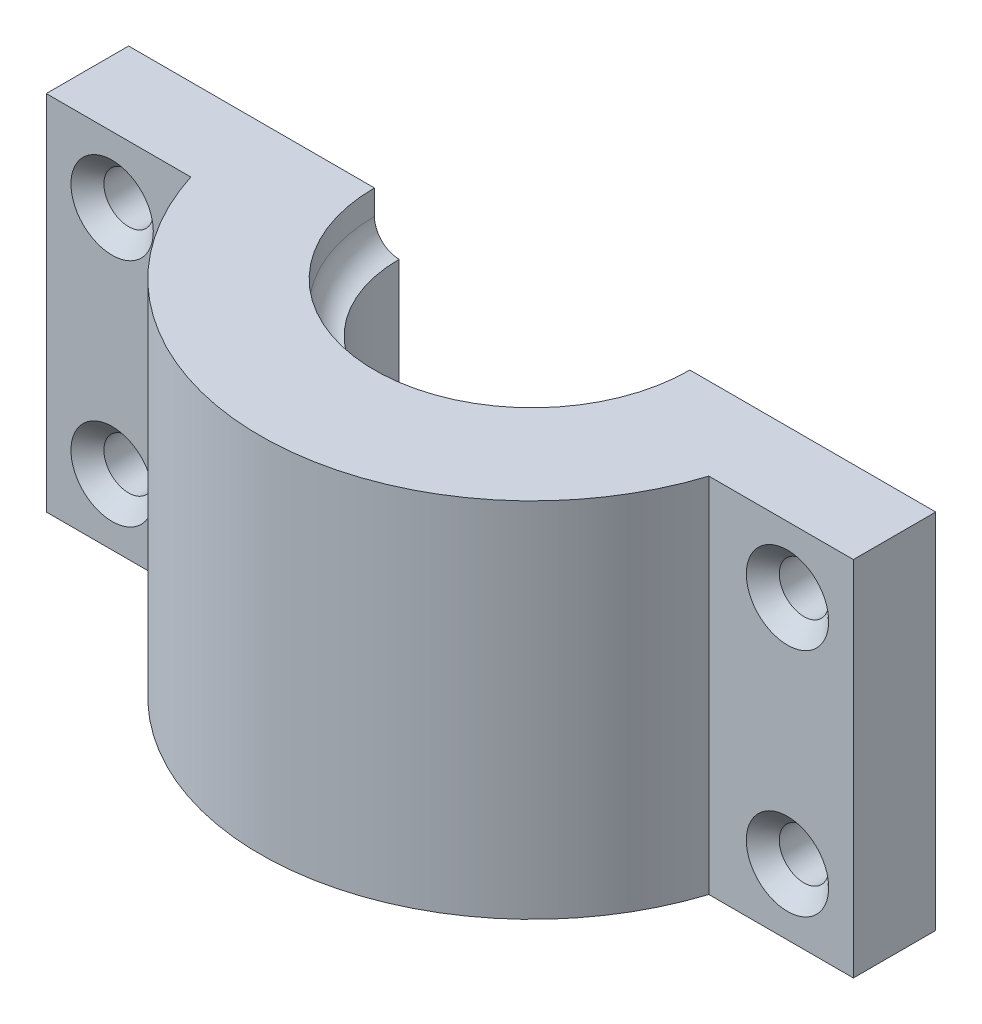
ISO-10303-21;
HEADER;
FILE_DESCRIPTION(('STEP AP214'),'2;1');
FILE_NAME('part.step','',(''),(''),'','','');
FILE_SCHEMA(('AUTOMOTIVE_DESIGN { 1 0 10303 214 1 1 1 1 }'));
ENDSEC;
DATA;
#1=APPLICATION_CONTEXT('core data for automotive mechanical design processes');
#2=APPLICATION_PROTOCOL_DEFINITION('international standard','automotive_design',2000,#1);
#3=PRODUCT_CONTEXT('',#1,'mechanical');
#4=PRODUCT('Part','Part','',(#3));
#5=PRODUCT_RELATED_PRODUCT_CATEGORY('part','',(#4));
#6=PRODUCT_DEFINITION_FORMATION('','',#4);
#7=PRODUCT_DEFINITION_CONTEXT('part definition',#1,'design');
#8=PRODUCT_DEFINITION('design','',#6,#7);
#9=PRODUCT_DEFINITION_SHAPE('','',#8);
#10=(LENGTH_UNIT() NAMED_UNIT(*) SI_UNIT(.MILLI.,.METRE.));
#11=(NAMED_UNIT(*) PLANE_ANGLE_UNIT() SI_UNIT($,.RADIAN.));
#12=(NAMED_UNIT(*) SI_UNIT($,.STERADIAN.) SOLID_ANGLE_UNIT());
#13=UNCERTAINTY_MEASURE_WITH_UNIT(LENGTH_MEASURE(1.E-05),#10,'distance_accuracy_value','');
#14=(GEOMETRIC_REPRESENTATION_CONTEXT(3) GLOBAL_UNCERTAINTY_ASSIGNED_CONTEXT((#13)) GLOBAL_UNIT_ASSIGNED_CONTEXT((#10,
#11,#12)) REPRESENTATION_CONTEXT('',''));
#15=CARTESIAN_POINT('',(0.,0.,0.));
#16=DIRECTION('',(0.,0.,1.));
#17=DIRECTION('',(1.,0.,0.));
#18=AXIS2_PLACEMENT_3D('',#15,#16,#17);
#19=CARTESIAN_POINT('',(0.,-22.,0.));
#20=DIRECTION('',(0.,1.,0.));
#21=DIRECTION('',(0.,0.,1.));
#22=AXIS2_PLACEMENT_3D('',#19,#20,#21);
#23=CYLINDRICAL_SURFACE('',#22,16.5);
#24=CARTESIAN_POINT('',(0.,0.,0.));
#25=DIRECTION('',(0.,1.,0.));
#26=DIRECTION('',(0.,0.,1.));
#27=AXIS2_PLACEMENT_3D('',#24,#25,#26);
#28=CIRCLE('',#27,16.5);
#29=CARTESIAN_POINT('',(-15.7241851935164,0.,5.));
#30=VERTEX_POINT('',#29);
#31=CARTESIAN_POINT('',(15.7241851935164,0.,5.));
#32=VERTEX_POINT('',#31);
#33=EDGE_CURVE('E194',#30,#32,#28,.T.);
#34=ORIENTED_EDGE('',*,*,#33,.F.);
#35=DIRECTION('',(0.,1.,0.));
#36=VECTOR('',#35,1.);
#37=CARTESIAN_POINT('',(-15.7241851935164,-22.,5.));
#38=LINE('',#37,#36);
#39=CARTESIAN_POINT('',(-15.7241851935164,-22.,5.));
#40=VERTEX_POINT('',#39);
#41=EDGE_CURVE('E218',#40,#30,#38,.T.);
#42=ORIENTED_EDGE('',*,*,#41,.F.);
#43=CARTESIAN_POINT('',(0.,-22.,0.));
#44=DIRECTION('',(0.,1.,0.));
#45=DIRECTION('',(0.,0.,1.));
#46=AXIS2_PLACEMENT_3D('',#43,#44,#45);
#47=CIRCLE('',#46,16.5);
#48=CARTESIAN_POINT('',(15.7241851935164,-22.,5.));
#49=VERTEX_POINT('',#48);
#50=EDGE_CURVE('E168',#40,#49,#47,.T.);
#51=ORIENTED_EDGE('',*,*,#50,.T.);
#52=DIRECTION('',(0.,1.,0.));
#53=VECTOR('',#52,1.);
#54=CARTESIAN_POINT('',(15.7241851935164,-22.,5.));
#55=LINE('',#54,#53);
#56=EDGE_CURVE('E193',#49,#32,#55,.T.);
#57=ORIENTED_EDGE('',*,*,#56,.T.);
#58=EDGE_LOOP('',(#34,#42,#51,#57));
#59=FACE_BOUND('',#58,.T.);
#60=ADVANCED_FACE('F47',(#59),#23,.T.);
#61=CARTESIAN_POINT('',(0.,-22.,5.));
#62=DIRECTION('',(0.,0.,1.));
#63=DIRECTION('',(1.,0.,0.));
#64=AXIS2_PLACEMENT_3D('',#61,#62,#63);
#65=PLANE('',#64);
#66=CARTESIAN_POINT('',(-20.5,-4.,5.));
#67=DIRECTION('',(0.,0.,1.));
#68=DIRECTION('',(1.,0.,0.));
#69=AXIS2_PLACEMENT_3D('',#66,#67,#68);
#70=CIRCLE('',#69,2.5);
#71=CARTESIAN_POINT('',(-18.,-4.,5.));
#72=VERTEX_POINT('',#71);
#73=EDGE_CURVE('E274',#72,#72,#70,.F.);
#74=ORIENTED_EDGE('',*,*,#73,.T.);
#75=EDGE_LOOP('',(#74));
#76=FACE_BOUND('',#75,.T.);
#77=CARTESIAN_POINT('',(-20.5,-18.,5.));
#78=DIRECTION('',(0.,0.,1.));
#79=DIRECTION('',(1.,0.,0.));
#80=AXIS2_PLACEMENT_3D('',#77,#78,#79);
#81=CIRCLE('',#80,2.50000000000002);
#82=CARTESIAN_POINT('',(-18.,-18.,5.));
#83=VERTEX_POINT('',#82);
#84=EDGE_CURVE('E270',#83,#83,#81,.F.);
#85=ORIENTED_EDGE('',*,*,#84,.T.);
#86=EDGE_LOOP('',(#85));
#87=FACE_BOUND('',#86,.T.);
#88=DIRECTION('',(1.,0.,0.));
#89=VECTOR('',#88,1.);
#90=CARTESIAN_POINT('',(0.,0.,5.));
#91=LINE('',#90,#89);
#92=CARTESIAN_POINT('',(-24.5,0.,5.));
#93=VERTEX_POINT('',#92);
#94=EDGE_CURVE('E173',#93,#30,#91,.T.);
#95=ORIENTED_EDGE('',*,*,#94,.F.);
#96=DIRECTION('',(0.,1.,0.));
#97=VECTOR('',#96,1.);
#98=CARTESIAN_POINT('',(-24.5,-22.,5.));
#99=LINE('',#98,#97);
#100=CARTESIAN_POINT('',(-24.5,-22.,5.));
#101=VERTEX_POINT('',#100);
#102=EDGE_CURVE('E222',#101,#93,#99,.T.);
#103=ORIENTED_EDGE('',*,*,#102,.F.);
#104=DIRECTION('',(1.,0.,0.));
#105=VECTOR('',#104,1.);
#106=CARTESIAN_POINT('',(0.,-22.,5.));
#107=LINE('',#106,#105);
#108=EDGE_CURVE('E189',#101,#40,#107,.T.);
#109=ORIENTED_EDGE('',*,*,#108,.T.);
#110=ORIENTED_EDGE('',*,*,#41,.T.);
#111=EDGE_LOOP('',(#95,#103,#109,#110));
#112=FACE_BOUND('',#111,.T.);
#113=ADVANCED_FACE('F326',(#76,#87,#112),#65,.T.);
#114=CARTESIAN_POINT('',(-24.5,-22.,0.));
#115=DIRECTION('',(-1.,0.,0.));
#116=DIRECTION('',(0.,0.,1.));
#117=AXIS2_PLACEMENT_3D('',#114,#115,#116);
#118=PLANE('',#117);
#119=DIRECTION('',(0.,0.,1.));
#120=VECTOR('',#119,1.);
#121=CARTESIAN_POINT('',(-24.5,0.,0.));
#122=LINE('',#121,#120);
#123=CARTESIAN_POINT('',(-24.5,0.,0.));
#124=VERTEX_POINT('',#123);
#125=EDGE_CURVE('E211',#124,#93,#122,.T.);
#126=ORIENTED_EDGE('',*,*,#125,.F.);
#127=DIRECTION('',(0.,1.,0.));
#128=VECTOR('',#127,1.);
#129=CARTESIAN_POINT('',(-24.5,-22.,0.));
#130=LINE('',#129,#128);
#131=CARTESIAN_POINT('',(-24.5,-22.,0.));
#132=VERTEX_POINT('',#131);
#133=EDGE_CURVE('E225',#132,#124,#130,.T.);
#134=ORIENTED_EDGE('',*,*,#133,.F.);
#135=DIRECTION('',(0.,0.,1.));
#136=VECTOR('',#135,1.);
#137=CARTESIAN_POINT('',(-24.5,-22.,0.));
#138=LINE('',#137,#136);
#139=EDGE_CURVE('E185',#132,#101,#138,.T.);
#140=ORIENTED_EDGE('',*,*,#139,.T.);
#141=ORIENTED_EDGE('',*,*,#102,.T.);
#142=EDGE_LOOP('',(#126,#134,#140,#141));
#143=FACE_BOUND('',#142,.T.);
#144=ADVANCED_FACE('F330',(#143),#118,.T.);
#145=CARTESIAN_POINT('',(0.,-22.,0.));
#146=DIRECTION('',(0.,0.,-1.));
#147=DIRECTION('',(-1.,0.,0.));
#148=AXIS2_PLACEMENT_3D('',#145,#146,#147);
#149=PLANE('',#148);
#150=DIRECTION('',(0.,1.,0.));
#151=VECTOR('',#150,1.);
#152=CARTESIAN_POINT('',(-9.575,1.86021184115159,0.));
#153=LINE('',#152,#151);
#154=CARTESIAN_POINT('',(-9.575,-1.5,0.));
#155=VERTEX_POINT('',#154);
#156=CARTESIAN_POINT('',(-9.575,0.,0.));
#157=VERTEX_POINT('',#156);
#158=EDGE_CURVE('E63',#155,#157,#153,.T.);
#159=ORIENTED_EDGE('',*,*,#158,.F.);
#160=CARTESIAN_POINT('',(-8.075,-1.5,0.));
#161=DIRECTION('',(0.,0.,-1.));
#162=DIRECTION('',(-1.,0.,0.));
#163=AXIS2_PLACEMENT_3D('',#160,#161,#162);
#164=CIRCLE('',#163,1.5);
#165=CARTESIAN_POINT('',(-8.075,-3.,0.));
#166=VERTEX_POINT('',#165);
#167=EDGE_CURVE('E134',#166,#155,#164,.T.);
#168=ORIENTED_EDGE('',*,*,#167,.F.);
#169=DIRECTION('',(0.,1.,0.));
#170=VECTOR('',#169,1.);
#171=CARTESIAN_POINT('',(-8.075,-22.,0.));
#172=LINE('',#171,#170);
#173=CARTESIAN_POINT('',(-8.075,-14.9999999999999,0.));
#174=VERTEX_POINT('',#173);
#175=EDGE_CURVE('E228',#174,#166,#172,.T.);
#176=ORIENTED_EDGE('',*,*,#175,.F.);
#177=DIRECTION('',(0.274721127897375,0.961523947640824,0.));
#178=VECTOR('',#177,1.);
#179=CARTESIAN_POINT('',(0.,13.2625000000004,0.));
#180=LINE('',#179,#178);
#181=CARTESIAN_POINT('',(-10.075,-22.,0.));
#182=VERTEX_POINT('',#181);
#183=EDGE_CURVE('E57',#174,#182,#180,.F.);
#184=ORIENTED_EDGE('',*,*,#183,.T.);
#185=DIRECTION('',(-1.,0.,0.));
#186=VECTOR('',#185,1.);
#187=CARTESIAN_POINT('',(0.,-22.,0.));
#188=LINE('',#187,#186);
#189=EDGE_CURVE('E182',#182,#132,#188,.T.);
#190=ORIENTED_EDGE('',*,*,#189,.T.);
#191=ORIENTED_EDGE('',*,*,#133,.T.);
#192=DIRECTION('',(-1.,0.,0.));
#193=VECTOR('',#192,1.);
#194=CARTESIAN_POINT('',(0.,0.,0.));
#195=LINE('',#194,#193);
#196=EDGE_CURVE('E153',#157,#124,#195,.T.);
#197=ORIENTED_EDGE('',*,*,#196,.F.);
#198=EDGE_LOOP('',(#159,#168,#176,#184,#190,#191,#197));
#199=FACE_BOUND('',#198,.T.);
#200=CARTESIAN_POINT('',(-20.5,-18.,0.));
#201=DIRECTION('',(0.,0.,-1.));
#202=DIRECTION('',(-1.,0.,0.));
#203=AXIS2_PLACEMENT_3D('',#200,#201,#202);
#204=CIRCLE('',#203,1.5);
#205=CARTESIAN_POINT('',(-22.,-18.,0.));
#206=VERTEX_POINT('',#205);
#207=EDGE_CURVE('E199',#206,#206,#204,.T.);
#208=ORIENTED_EDGE('',*,*,#207,.F.);
#209=EDGE_LOOP('',(#208));
#210=FACE_BOUND('',#209,.T.);
#211=CARTESIAN_POINT('',(-20.5,-4.,0.));
#212=DIRECTION('',(0.,0.,-1.));
#213=DIRECTION('',(-1.,0.,0.));
#214=AXIS2_PLACEMENT_3D('',#211,#212,#213);
#215=CIRCLE('',#214,1.5);
#216=CARTESIAN_POINT('',(-22.,-4.,0.));
#217=VERTEX_POINT('',#216);
#218=EDGE_CURVE('E167',#217,#217,#215,.T.);
#219=ORIENTED_EDGE('',*,*,#218,.F.);
#220=EDGE_LOOP('',(#219));
#221=FACE_BOUND('',#220,.T.);
#222=ADVANCED_FACE('F150',(#199,#210,#221),#149,.T.);
#223=CARTESIAN_POINT('',(0.,-22.,0.));
#224=DIRECTION('',(0.,1.,0.));
#225=DIRECTION('',(0.,0.,1.));
#226=AXIS2_PLACEMENT_3D('',#223,#224,#225);
#227=CYLINDRICAL_SURFACE('',#226,8.075);
#228=ORIENTED_EDGE('',*,*,#175,.T.);
#229=CARTESIAN_POINT('',(0.,-3.,0.));
#230=DIRECTION('',(0.,1.,0.));
#231=DIRECTION('',(-1.,0.,0.));
#232=AXIS2_PLACEMENT_3D('',#229,#230,#231);
#233=CIRCLE('',#232,8.075);
#234=CARTESIAN_POINT('',(8.075,-3.,0.));
#235=VERTEX_POINT('',#234);
#236=EDGE_CURVE('E139',#166,#235,#233,.T.);
#237=ORIENTED_EDGE('',*,*,#236,.T.);
#238=DIRECTION('',(0.,1.,0.));
#239=VECTOR('',#238,1.);
#240=CARTESIAN_POINT('',(8.075,-22.,0.));
#241=LINE('',#240,#239);
#242=CARTESIAN_POINT('',(8.075,-14.9999999999999,0.));
#243=VERTEX_POINT('',#242);
#244=EDGE_CURVE('E231',#243,#235,#241,.T.);
#245=ORIENTED_EDGE('',*,*,#244,.F.);
#246=CARTESIAN_POINT('',(0.,-14.9999999999999,0.));
#247=DIRECTION('',(0.,1.,0.));
#248=DIRECTION('',(0.,0.,1.));
#249=AXIS2_PLACEMENT_3D('',#246,#247,#248);
#250=CIRCLE('',#249,8.075);
#251=EDGE_CURVE('E71',#243,#174,#250,.F.);
#252=ORIENTED_EDGE('',*,*,#251,.T.);
#253=EDGE_LOOP('',(#228,#237,#245,#252));
#254=FACE_BOUND('',#253,.T.);
#255=ADVANCED_FACE('F304',(#254),#227,.F.);
#256=CARTESIAN_POINT('',(0.,-22.,0.));
#257=DIRECTION('',(0.,0.,1.));
#258=DIRECTION('',(1.,0.,0.));
#259=AXIS2_PLACEMENT_3D('',#256,#257,#258);
#260=PLANE('',#259);
#261=CARTESIAN_POINT('',(20.5,-4.,0.));
#262=DIRECTION('',(0.,0.,1.));
#263=DIRECTION('',(1.,0.,0.));
#264=AXIS2_PLACEMENT_3D('',#261,#262,#263);
#265=CIRCLE('',#264,1.5);
#266=CARTESIAN_POINT('',(22.,-4.,0.));
#267=VERTEX_POINT('',#266);
#268=EDGE_CURVE('E160',#267,#267,#265,.T.);
#269=ORIENTED_EDGE('',*,*,#268,.T.);
#270=EDGE_LOOP('',(#269));
#271=FACE_BOUND('',#270,.T.);
#272=CARTESIAN_POINT('',(20.5,-18.,0.));
#273=DIRECTION('',(0.,0.,1.));
#274=DIRECTION('',(1.,0.,0.));
#275=AXIS2_PLACEMENT_3D('',#272,#273,#274);
#276=CIRCLE('',#275,1.5);
#277=CARTESIAN_POINT('',(22.,-18.,0.));
#278=VERTEX_POINT('',#277);
#279=EDGE_CURVE('E155',#278,#278,#276,.T.);
#280=ORIENTED_EDGE('',*,*,#279,.T.);
#281=EDGE_LOOP('',(#280));
#282=FACE_BOUND('',#281,.T.);
#283=CARTESIAN_POINT('',(8.075,-1.5,0.));
#284=DIRECTION('',(0.,0.,1.));
#285=DIRECTION('',(1.,0.,0.));
#286=AXIS2_PLACEMENT_3D('',#283,#284,#285);
#287=CIRCLE('',#286,1.5);
#288=CARTESIAN_POINT('',(9.575,-1.5,0.));
#289=VERTEX_POINT('',#288);
#290=EDGE_CURVE('E147',#235,#289,#287,.T.);
#291=ORIENTED_EDGE('',*,*,#290,.T.);
#292=DIRECTION('',(0.,1.,0.));
#293=VECTOR('',#292,1.);
#294=CARTESIAN_POINT('',(9.575,1.86021184115158,0.));
#295=LINE('',#294,#293);
#296=CARTESIAN_POINT('',(9.575,0.,0.));
#297=VERTEX_POINT('',#296);
#298=EDGE_CURVE('E142',#289,#297,#295,.T.);
#299=ORIENTED_EDGE('',*,*,#298,.T.);
#300=DIRECTION('',(1.,0.,0.));
#301=VECTOR('',#300,1.);
#302=CARTESIAN_POINT('',(0.,0.,0.));
#303=LINE('',#302,#301);
#304=CARTESIAN_POINT('',(24.5,0.,0.));
#305=VERTEX_POINT('',#304);
#306=EDGE_CURVE('E206',#297,#305,#303,.T.);
#307=ORIENTED_EDGE('',*,*,#306,.T.);
#308=DIRECTION('',(0.,1.,0.));
#309=VECTOR('',#308,1.);
#310=CARTESIAN_POINT('',(24.5,-22.,0.));
#311=LINE('',#310,#309);
#312=CARTESIAN_POINT('',(24.5,-22.,0.));
#313=VERTEX_POINT('',#312);
#314=EDGE_CURVE('E235',#313,#305,#311,.T.);
#315=ORIENTED_EDGE('',*,*,#314,.F.);
#316=DIRECTION('',(1.,0.,0.));
#317=VECTOR('',#316,1.);
#318=CARTESIAN_POINT('',(0.,-22.,0.));
#319=LINE('',#318,#317);
#320=CARTESIAN_POINT('',(10.075,-22.,0.));
#321=VERTEX_POINT('',#320);
#322=EDGE_CURVE('E179',#321,#313,#319,.T.);
#323=ORIENTED_EDGE('',*,*,#322,.F.);
#324=DIRECTION('',(-0.274721127897375,0.961523947640824,0.));
#325=VECTOR('',#324,1.);
#326=CARTESIAN_POINT('',(0.,13.2625000000004,0.));
#327=LINE('',#326,#325);
#328=EDGE_CURVE('E286',#321,#243,#327,.T.);
#329=ORIENTED_EDGE('',*,*,#328,.T.);
#330=ORIENTED_EDGE('',*,*,#244,.T.);
#331=EDGE_LOOP('',(#291,#299,#307,#315,#323,#329,#330));
#332=FACE_BOUND('',#331,.T.);
#333=ADVANCED_FACE('F302',(#271,#282,#332),#260,.F.);
#334=CARTESIAN_POINT('',(24.5,-22.,0.));
#335=DIRECTION('',(-1.,0.,0.));
#336=DIRECTION('',(0.,0.,1.));
#337=AXIS2_PLACEMENT_3D('',#334,#335,#336);
#338=PLANE('',#337);
#339=DIRECTION('',(0.,0.,1.));
#340=VECTOR('',#339,1.);
#341=CARTESIAN_POINT('',(24.5,0.,0.));
#342=LINE('',#341,#340);
#343=CARTESIAN_POINT('',(24.5,0.,5.));
#344=VERTEX_POINT('',#343);
#345=EDGE_CURVE('E203',#305,#344,#342,.T.);
#346=ORIENTED_EDGE('',*,*,#345,.T.);
#347=DIRECTION('',(0.,1.,0.));
#348=VECTOR('',#347,1.);
#349=CARTESIAN_POINT('',(24.5,-22.,5.));
#350=LINE('',#349,#348);
#351=CARTESIAN_POINT('',(24.5,-22.,5.));
#352=VERTEX_POINT('',#351);
#353=EDGE_CURVE('E239',#352,#344,#350,.T.);
#354=ORIENTED_EDGE('',*,*,#353,.F.);
#355=DIRECTION('',(0.,0.,1.));
#356=VECTOR('',#355,1.);
#357=CARTESIAN_POINT('',(24.5,-22.,0.));
#358=LINE('',#357,#356);
#359=EDGE_CURVE('E176',#313,#352,#358,.T.);
#360=ORIENTED_EDGE('',*,*,#359,.F.);
#361=ORIENTED_EDGE('',*,*,#314,.T.);
#362=EDGE_LOOP('',(#346,#354,#360,#361));
#363=FACE_BOUND('',#362,.T.);
#364=ADVANCED_FACE('F316',(#363),#338,.F.);
#365=CARTESIAN_POINT('',(0.,-22.,5.));
#366=DIRECTION('',(0.,0.,-1.));
#367=DIRECTION('',(-1.,0.,0.));
#368=AXIS2_PLACEMENT_3D('',#365,#366,#367);
#369=PLANE('',#368);
#370=CARTESIAN_POINT('',(20.5,-4.,5.));
#371=DIRECTION('',(0.,0.,-1.));
#372=DIRECTION('',(-1.,0.,0.));
#373=AXIS2_PLACEMENT_3D('',#370,#371,#372);
#374=CIRCLE('',#373,2.5);
#375=CARTESIAN_POINT('',(18.,-4.,5.));
#376=VERTEX_POINT('',#375);
#377=EDGE_CURVE('E258',#376,#376,#374,.T.);
#378=ORIENTED_EDGE('',*,*,#377,.T.);
#379=EDGE_LOOP('',(#378));
#380=FACE_BOUND('',#379,.T.);
#381=CARTESIAN_POINT('',(20.5,-18.,5.));
#382=DIRECTION('',(0.,0.,-1.));
#383=DIRECTION('',(-1.,0.,0.));
#384=AXIS2_PLACEMENT_3D('',#381,#382,#383);
#385=CIRCLE('',#384,2.50000000000002);
#386=CARTESIAN_POINT('',(18.,-18.,5.));
#387=VERTEX_POINT('',#386);
#388=EDGE_CURVE('E254',#387,#387,#385,.T.);
#389=ORIENTED_EDGE('',*,*,#388,.T.);
#390=EDGE_LOOP('',(#389));
#391=FACE_BOUND('',#390,.T.);
#392=DIRECTION('',(-1.,0.,0.));
#393=VECTOR('',#392,1.);
#394=CARTESIAN_POINT('',(0.,0.,5.));
#395=LINE('',#394,#393);
#396=EDGE_CURVE('E198',#344,#32,#395,.T.);
#397=ORIENTED_EDGE('',*,*,#396,.T.);
#398=ORIENTED_EDGE('',*,*,#56,.F.);
#399=DIRECTION('',(-1.,0.,0.));
#400=VECTOR('',#399,1.);
#401=CARTESIAN_POINT('',(0.,-22.,5.));
#402=LINE('',#401,#400);
#403=EDGE_CURVE('E172',#352,#49,#402,.T.);
#404=ORIENTED_EDGE('',*,*,#403,.F.);
#405=ORIENTED_EDGE('',*,*,#353,.T.);
#406=EDGE_LOOP('',(#397,#398,#404,#405));
#407=FACE_BOUND('',#406,.T.);
#408=ADVANCED_FACE('F320',(#380,#391,#407),#369,.F.);
#409=CARTESIAN_POINT('',(0.,-22.,0.));
#410=DIRECTION('',(0.,1.,0.));
#411=DIRECTION('',(0.,0.,1.));
#412=AXIS2_PLACEMENT_3D('',#409,#410,#411);
#413=PLANE('',#412);
#414=ORIENTED_EDGE('',*,*,#189,.F.);
#415=CARTESIAN_POINT('',(0.,-22.,0.));
#416=DIRECTION('',(0.,1.,0.));
#417=DIRECTION('',(0.,0.,1.));
#418=AXIS2_PLACEMENT_3D('',#415,#416,#417);
#419=CIRCLE('',#418,10.075);
#420=EDGE_CURVE('E282',#182,#321,#419,.T.);
#421=ORIENTED_EDGE('',*,*,#420,.T.);
#422=ORIENTED_EDGE('',*,*,#322,.T.);
#423=ORIENTED_EDGE('',*,*,#359,.T.);
#424=ORIENTED_EDGE('',*,*,#403,.T.);
#425=ORIENTED_EDGE('',*,*,#50,.F.);
#426=ORIENTED_EDGE('',*,*,#108,.F.);
#427=ORIENTED_EDGE('',*,*,#139,.F.);
#428=EDGE_LOOP('',(#414,#421,#422,#423,#424,#425,#426,#427));
#429=FACE_BOUND('',#428,.T.);
#430=ADVANCED_FACE('F298',(#429),#413,.F.);
#431=CARTESIAN_POINT('',(0.,0.,0.));
#432=DIRECTION('',(0.,1.,0.));
#433=DIRECTION('',(0.,0.,1.));
#434=AXIS2_PLACEMENT_3D('',#431,#432,#433);
#435=PLANE('',#434);
#436=CARTESIAN_POINT('',(0.,0.,0.));
#437=DIRECTION('',(0.,1.,0.));
#438=DIRECTION('',(0.,0.,1.));
#439=AXIS2_PLACEMENT_3D('',#436,#437,#438);
#440=CIRCLE('',#439,9.575);
#441=EDGE_CURVE('E11',#157,#297,#440,.T.);
#442=ORIENTED_EDGE('',*,*,#441,.F.);
#443=ORIENTED_EDGE('',*,*,#196,.T.);
#444=ORIENTED_EDGE('',*,*,#125,.T.);
#445=ORIENTED_EDGE('',*,*,#94,.T.);
#446=ORIENTED_EDGE('',*,*,#33,.T.);
#447=ORIENTED_EDGE('',*,*,#396,.F.);
#448=ORIENTED_EDGE('',*,*,#345,.F.);
#449=ORIENTED_EDGE('',*,*,#306,.F.);
#450=EDGE_LOOP('',(#442,#443,#444,#445,#446,#447,#448,#449));
#451=FACE_BOUND('',#450,.T.);
#452=ADVANCED_FACE('F312',(#451),#435,.T.);
#453=CARTESIAN_POINT('',(20.5,-18.,-6.6746653814699));
#454=DIRECTION('',(0.,0.,1.));
#455=DIRECTION('',(1.,0.,0.));
#456=AXIS2_PLACEMENT_3D('',#453,#454,#455);
#457=CYLINDRICAL_SURFACE('',#456,1.5);
#458=CARTESIAN_POINT('',(20.5,-18.,3.99999999999999));
#459=DIRECTION('',(0.,0.,-1.));
#460=DIRECTION('',(-1.,0.,0.));
#461=AXIS2_PLACEMENT_3D('',#458,#459,#460);
#462=CIRCLE('',#461,1.5);
#463=CARTESIAN_POINT('',(19.,-18.,3.99999999999999));
#464=VERTEX_POINT('',#463);
#465=EDGE_CURVE('E262',#464,#464,#462,.F.);
#466=ORIENTED_EDGE('',*,*,#465,.T.);
#467=EDGE_LOOP('',(#466));
#468=FACE_BOUND('',#467,.T.);
#469=ORIENTED_EDGE('',*,*,#279,.F.);
#470=EDGE_LOOP('',(#469));
#471=FACE_BOUND('',#470,.T.);
#472=ADVANCED_FACE('F392',(#468,#471),#457,.F.);
#473=CARTESIAN_POINT('',(20.5,-4.,-6.6746653814699));
#474=DIRECTION('',(0.,0.,1.));
#475=DIRECTION('',(1.,0.,0.));
#476=AXIS2_PLACEMENT_3D('',#473,#474,#475);
#477=CYLINDRICAL_SURFACE('',#476,1.5);
#478=CARTESIAN_POINT('',(20.5,-4.,4.00000000000001));
#479=DIRECTION('',(0.,0.,-1.));
#480=DIRECTION('',(-1.,0.,0.));
#481=AXIS2_PLACEMENT_3D('',#478,#479,#480);
#482=CIRCLE('',#481,1.5);
#483=CARTESIAN_POINT('',(19.,-4.,4.00000000000001));
#484=VERTEX_POINT('',#483);
#485=EDGE_CURVE('E221',#484,#484,#482,.F.);
#486=ORIENTED_EDGE('',*,*,#485,.T.);
#487=EDGE_LOOP('',(#486));
#488=FACE_BOUND('',#487,.T.);
#489=ORIENTED_EDGE('',*,*,#268,.F.);
#490=EDGE_LOOP('',(#489));
#491=FACE_BOUND('',#490,.T.);
#492=ADVANCED_FACE('F386',(#488,#491),#477,.F.);
#493=CARTESIAN_POINT('',(-20.5,-4.,-6.6746653814699));
#494=DIRECTION('',(0.,0.,1.));
#495=DIRECTION('',(1.,0.,0.));
#496=AXIS2_PLACEMENT_3D('',#493,#494,#495);
#497=CYLINDRICAL_SURFACE('',#496,1.5);
#498=CARTESIAN_POINT('',(-20.5,-4.,4.00000000000001));
#499=DIRECTION('',(0.,0.,1.));
#500=DIRECTION('',(1.,0.,0.));
#501=AXIS2_PLACEMENT_3D('',#498,#499,#500);
#502=CIRCLE('',#501,1.5);
#503=CARTESIAN_POINT('',(-19.,-4.,4.00000000000001));
#504=VERTEX_POINT('',#503);
#505=EDGE_CURVE('E266',#504,#504,#502,.T.);
#506=ORIENTED_EDGE('',*,*,#505,.T.);
#507=EDGE_LOOP('',(#506));
#508=FACE_BOUND('',#507,.T.);
#509=ORIENTED_EDGE('',*,*,#218,.T.);
#510=EDGE_LOOP('',(#509));
#511=FACE_BOUND('',#510,.T.);
#512=ADVANCED_FACE('F377',(#508,#511),#497,.F.);
#513=CARTESIAN_POINT('',(-20.5,-18.,-6.6746653814699));
#514=DIRECTION('',(0.,0.,1.));
#515=DIRECTION('',(1.,0.,0.));
#516=AXIS2_PLACEMENT_3D('',#513,#514,#515);
#517=CYLINDRICAL_SURFACE('',#516,1.5);
#518=CARTESIAN_POINT('',(-20.5,-18.,3.99999999999999));
#519=DIRECTION('',(0.,0.,1.));
#520=DIRECTION('',(1.,0.,0.));
#521=AXIS2_PLACEMENT_3D('',#518,#519,#520);
#522=CIRCLE('',#521,1.5);
#523=CARTESIAN_POINT('',(-19.,-18.,3.99999999999999));
#524=VERTEX_POINT('',#523);
#525=EDGE_CURVE('E278',#524,#524,#522,.T.);
#526=ORIENTED_EDGE('',*,*,#525,.T.);
#527=EDGE_LOOP('',(#526));
#528=FACE_BOUND('',#527,.T.);
#529=ORIENTED_EDGE('',*,*,#207,.T.);
#530=EDGE_LOOP('',(#529));
#531=FACE_BOUND('',#530,.T.);
#532=ADVANCED_FACE('F349',(#528,#531),#517,.F.);
#533=CARTESIAN_POINT('',(20.5,-4.,4.00000000000001));
#534=DIRECTION('',(0.,0.,1.));
#535=DIRECTION('',(1.,0.,0.));
#536=AXIS2_PLACEMENT_3D('',#533,#534,#535);
#537=CONICAL_SURFACE('',#536,1.5,0.785398163397449);
#538=ORIENTED_EDGE('',*,*,#377,.F.);
#539=EDGE_LOOP('',(#538));
#540=FACE_BOUND('',#539,.T.);
#541=ORIENTED_EDGE('',*,*,#485,.F.);
#542=EDGE_LOOP('',(#541));
#543=FACE_BOUND('',#542,.T.);
#544=ADVANCED_FACE('F342',(#540,#543),#537,.F.);
#545=CARTESIAN_POINT('',(20.5,-18.,3.99999999999999));
#546=DIRECTION('',(0.,0.,1.));
#547=DIRECTION('',(1.,0.,0.));
#548=AXIS2_PLACEMENT_3D('',#545,#546,#547);
#549=CONICAL_SURFACE('',#548,1.5,0.785398163397449);
#550=ORIENTED_EDGE('',*,*,#388,.F.);
#551=EDGE_LOOP('',(#550));
#552=FACE_BOUND('',#551,.T.);
#553=ORIENTED_EDGE('',*,*,#465,.F.);
#554=EDGE_LOOP('',(#553));
#555=FACE_BOUND('',#554,.T.);
#556=ADVANCED_FACE('F348',(#552,#555),#549,.F.);
#557=CARTESIAN_POINT('',(-20.5,-4.,4.00000000000001));
#558=DIRECTION('',(0.,0.,1.));
#559=DIRECTION('',(1.,0.,0.));
#560=AXIS2_PLACEMENT_3D('',#557,#558,#559);
#561=CONICAL_SURFACE('',#560,1.5,0.785398163397449);
#562=ORIENTED_EDGE('',*,*,#73,.F.);
#563=EDGE_LOOP('',(#562));
#564=FACE_BOUND('',#563,.T.);
#565=ORIENTED_EDGE('',*,*,#505,.F.);
#566=EDGE_LOOP('',(#565));
#567=FACE_BOUND('',#566,.T.);
#568=ADVANCED_FACE('F356',(#564,#567),#561,.F.);
#569=CARTESIAN_POINT('',(-20.5,-18.,3.99999999999999));
#570=DIRECTION('',(0.,0.,1.));
#571=DIRECTION('',(1.,0.,0.));
#572=AXIS2_PLACEMENT_3D('',#569,#570,#571);
#573=CONICAL_SURFACE('',#572,1.5,0.785398163397449);
#574=ORIENTED_EDGE('',*,*,#84,.F.);
#575=EDGE_LOOP('',(#574));
#576=FACE_BOUND('',#575,.T.);
#577=ORIENTED_EDGE('',*,*,#525,.F.);
#578=EDGE_LOOP('',(#577));
#579=FACE_BOUND('',#578,.T.);
#580=ADVANCED_FACE('F362',(#576,#579),#573,.F.);
#581=CARTESIAN_POINT('',(0.,-22.,0.));
#582=DIRECTION('',(0.,-1.,0.));
#583=DIRECTION('',(0.,0.,-1.));
#584=AXIS2_PLACEMENT_3D('',#581,#582,#583);
#585=CONICAL_SURFACE('',#584,10.075,0.278299659005108);
#586=ORIENTED_EDGE('',*,*,#183,.F.);
#587=ORIENTED_EDGE('',*,*,#251,.F.);
#588=ORIENTED_EDGE('',*,*,#328,.F.);
#589=ORIENTED_EDGE('',*,*,#420,.F.);
#590=EDGE_LOOP('',(#586,#587,#588,#589));
#591=FACE_BOUND('',#590,.T.);
#592=ADVANCED_FACE('F50',(#591),#585,.F.);
#593=CARTESIAN_POINT('',(0.,1.86021184115158,0.));
#594=DIRECTION('',(0.,1.,0.));
#595=DIRECTION('',(-1.,0.,0.));
#596=AXIS2_PLACEMENT_3D('',#593,#594,#595);
#597=CYLINDRICAL_SURFACE('',#596,9.575);
#598=ORIENTED_EDGE('',*,*,#158,.T.);
#599=ORIENTED_EDGE('',*,*,#441,.T.);
#600=ORIENTED_EDGE('',*,*,#298,.F.);
#601=CARTESIAN_POINT('',(0.,-1.5,0.));
#602=DIRECTION('',(0.,1.,0.));
#603=DIRECTION('',(-1.,0.,0.));
#604=AXIS2_PLACEMENT_3D('',#601,#602,#603);
#605=CIRCLE('',#604,9.575);
#606=EDGE_CURVE('E136',#155,#289,#605,.T.);
#607=ORIENTED_EDGE('',*,*,#606,.F.);
#608=EDGE_LOOP('',(#598,#599,#600,#607));
#609=FACE_BOUND('',#608,.T.);
#610=ADVANCED_FACE('F144',(#609),#597,.F.);
#611=CARTESIAN_POINT('',(0.,-1.5,0.));
#612=DIRECTION('',(0.,1.,0.));
#613=DIRECTION('',(-1.,0.,0.));
#614=AXIS2_PLACEMENT_3D('',#611,#612,#613);
#615=TOROIDAL_SURFACE('',#614,8.075,1.5);
#616=ORIENTED_EDGE('',*,*,#167,.T.);
#617=ORIENTED_EDGE('',*,*,#606,.T.);
#618=ORIENTED_EDGE('',*,*,#290,.F.);
#619=ORIENTED_EDGE('',*,*,#236,.F.);
#620=EDGE_LOOP('',(#616,#617,#618,#619));
#621=FACE_BOUND('',#620,.T.);
#622=ADVANCED_FACE('F135',(#621),#615,.F.);
#623=CLOSED_SHELL('',(#60,#113,#144,#222,#255,#333,#364,#408,#430,#452,#472,#492,#512,#532,#544,
#556,#568,#580,#592,#610,#622));
#624=MANIFOLD_SOLID_BREP('B2',#623);
#625=ADVANCED_BREP_SHAPE_REPRESENTATION('',(#18,#624),#14);
#626=SHAPE_DEFINITION_REPRESENTATION(#9,#625);
ENDSEC;
END-ISO-10303-21;
